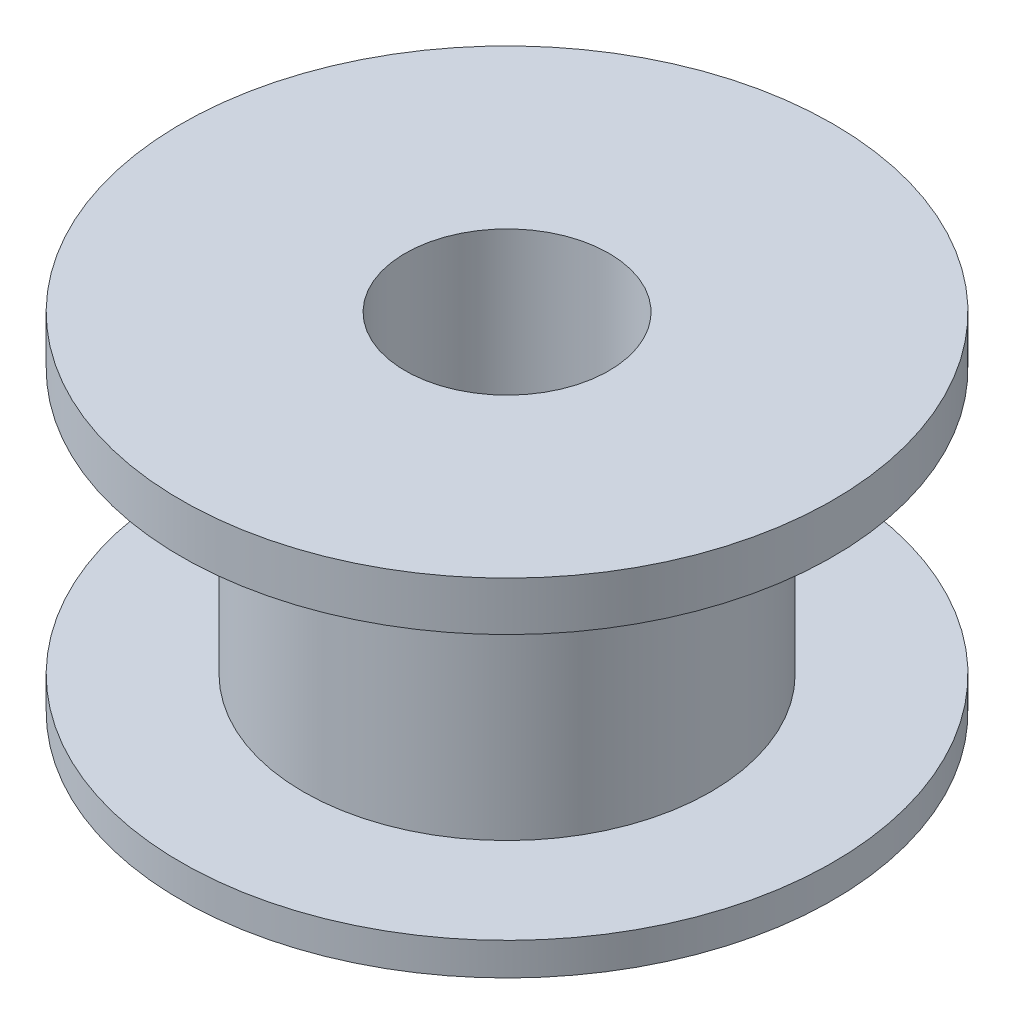
ISO-10303-21;
HEADER;
FILE_DESCRIPTION(('STEP AP214'),'2;1');
FILE_NAME('part.step','',(''),(''),'','','');
FILE_SCHEMA(('AUTOMOTIVE_DESIGN { 1 0 10303 214 1 1 1 1 }'));
ENDSEC;
DATA;
#1=APPLICATION_CONTEXT('core data for automotive mechanical design processes');
#2=APPLICATION_PROTOCOL_DEFINITION('international standard','automotive_design',2000,#1);
#3=PRODUCT_CONTEXT('',#1,'mechanical');
#4=PRODUCT('Part','Part','',(#3));
#5=PRODUCT_RELATED_PRODUCT_CATEGORY('part','',(#4));
#6=PRODUCT_DEFINITION_FORMATION('','',#4);
#7=PRODUCT_DEFINITION_CONTEXT('part definition',#1,'design');
#8=PRODUCT_DEFINITION('design','',#6,#7);
#9=PRODUCT_DEFINITION_SHAPE('','',#8);
#10=(LENGTH_UNIT() NAMED_UNIT(*) SI_UNIT(.MILLI.,.METRE.));
#11=(NAMED_UNIT(*) PLANE_ANGLE_UNIT() SI_UNIT($,.RADIAN.));
#12=(NAMED_UNIT(*) SI_UNIT($,.STERADIAN.) SOLID_ANGLE_UNIT());
#13=UNCERTAINTY_MEASURE_WITH_UNIT(LENGTH_MEASURE(1.E-05),#10,'distance_accuracy_value','');
#14=(GEOMETRIC_REPRESENTATION_CONTEXT(3) GLOBAL_UNCERTAINTY_ASSIGNED_CONTEXT((#13)) GLOBAL_UNIT_ASSIGNED_CONTEXT((#10,
#11,#12)) REPRESENTATION_CONTEXT('',''));
#15=CARTESIAN_POINT('',(0.,0.,0.));
#16=DIRECTION('',(0.,0.,1.));
#17=DIRECTION('',(1.,0.,0.));
#18=AXIS2_PLACEMENT_3D('',#15,#16,#17);
#19=CARTESIAN_POINT('',(8.,-4.25,0.));
#20=DIRECTION('',(0.,-1.,0.));
#21=DIRECTION('',(0.,0.,-1.));
#22=AXIS2_PLACEMENT_3D('',#19,#20,#21);
#23=PLANE('',#22);
#24=CARTESIAN_POINT('',(0.,-4.25,0.));
#25=DIRECTION('',(0.,-1.,0.));
#26=DIRECTION('',(0.,0.,-1.));
#27=AXIS2_PLACEMENT_3D('',#24,#25,#26);
#28=CIRCLE('',#27,8.);
#29=CARTESIAN_POINT('',(0.,-4.25,-8.));
#30=VERTEX_POINT('',#29);
#31=EDGE_CURVE('E59',#30,#30,#28,.T.);
#32=ORIENTED_EDGE('',*,*,#31,.T.);
#33=EDGE_LOOP('',(#32));
#34=FACE_BOUND('',#33,.T.);
#35=CARTESIAN_POINT('',(0.,-4.25,0.));
#36=DIRECTION('',(0.,-1.,0.));
#37=DIRECTION('',(0.,0.,-1.));
#38=AXIS2_PLACEMENT_3D('',#35,#36,#37);
#39=CIRCLE('',#38,2.5);
#40=CARTESIAN_POINT('',(0.,-4.25,-2.5));
#41=VERTEX_POINT('',#40);
#42=EDGE_CURVE('E10',#41,#41,#39,.T.);
#43=ORIENTED_EDGE('',*,*,#42,.F.);
#44=EDGE_LOOP('',(#43));
#45=FACE_BOUND('',#44,.T.);
#46=ADVANCED_FACE('F31',(#34,#45),#23,.T.);
#47=CARTESIAN_POINT('',(0.,-4.88152890571142,0.));
#48=DIRECTION('',(0.,-1.,0.));
#49=DIRECTION('',(0.,0.,-1.));
#50=AXIS2_PLACEMENT_3D('',#47,#48,#49);
#51=CYLINDRICAL_SURFACE('',#50,2.5);
#52=ORIENTED_EDGE('',*,*,#42,.T.);
#53=EDGE_LOOP('',(#52));
#54=FACE_BOUND('',#53,.T.);
#55=CARTESIAN_POINT('',(0.,4.25,0.));
#56=DIRECTION('',(0.,-1.,0.));
#57=DIRECTION('',(0.,0.,-1.));
#58=AXIS2_PLACEMENT_3D('',#55,#56,#57);
#59=CIRCLE('',#58,2.5);
#60=CARTESIAN_POINT('',(0.,4.25,-2.5));
#61=VERTEX_POINT('',#60);
#62=EDGE_CURVE('E37',#61,#61,#59,.T.);
#63=ORIENTED_EDGE('',*,*,#62,.F.);
#64=EDGE_LOOP('',(#63));
#65=FACE_BOUND('',#64,.T.);
#66=ADVANCED_FACE('F77',(#54,#65),#51,.F.);
#67=CARTESIAN_POINT('',(2.5,4.25,0.));
#68=DIRECTION('',(0.,1.,0.));
#69=DIRECTION('',(0.,0.,1.));
#70=AXIS2_PLACEMENT_3D('',#67,#68,#69);
#71=PLANE('',#70);
#72=ORIENTED_EDGE('',*,*,#62,.T.);
#73=EDGE_LOOP('',(#72));
#74=FACE_BOUND('',#73,.T.);
#75=CARTESIAN_POINT('',(0.,4.25,0.));
#76=DIRECTION('',(0.,-1.,0.));
#77=DIRECTION('',(0.,0.,-1.));
#78=AXIS2_PLACEMENT_3D('',#75,#76,#77);
#79=CIRCLE('',#78,8.);
#80=CARTESIAN_POINT('',(0.,4.25,-8.));
#81=VERTEX_POINT('',#80);
#82=EDGE_CURVE('E41',#81,#81,#79,.T.);
#83=ORIENTED_EDGE('',*,*,#82,.F.);
#84=EDGE_LOOP('',(#83));
#85=FACE_BOUND('',#84,.T.);
#86=ADVANCED_FACE('F81',(#74,#85),#71,.T.);
#87=CARTESIAN_POINT('',(0.,-4.88152890571142,0.));
#88=DIRECTION('',(0.,-1.,0.));
#89=DIRECTION('',(0.,0.,-1.));
#90=AXIS2_PLACEMENT_3D('',#87,#88,#89);
#91=CYLINDRICAL_SURFACE('',#90,8.);
#92=ORIENTED_EDGE('',*,*,#82,.T.);
#93=EDGE_LOOP('',(#92));
#94=FACE_BOUND('',#93,.T.);
#95=CARTESIAN_POINT('',(0.,3.05,0.));
#96=DIRECTION('',(0.,-1.,0.));
#97=DIRECTION('',(0.,0.,-1.));
#98=AXIS2_PLACEMENT_3D('',#95,#96,#97);
#99=CIRCLE('',#98,8.);
#100=CARTESIAN_POINT('',(0.,3.05,-8.));
#101=VERTEX_POINT('',#100);
#102=EDGE_CURVE('E45',#101,#101,#99,.T.);
#103=ORIENTED_EDGE('',*,*,#102,.F.);
#104=EDGE_LOOP('',(#103));
#105=FACE_BOUND('',#104,.T.);
#106=ADVANCED_FACE('F85',(#94,#105),#91,.T.);
#107=CARTESIAN_POINT('',(8.,3.05,0.));
#108=DIRECTION('',(0.,-1.,0.));
#109=DIRECTION('',(0.,0.,-1.));
#110=AXIS2_PLACEMENT_3D('',#107,#108,#109);
#111=PLANE('',#110);
#112=ORIENTED_EDGE('',*,*,#102,.T.);
#113=EDGE_LOOP('',(#112));
#114=FACE_BOUND('',#113,.T.);
#115=CARTESIAN_POINT('',(0.,3.05,0.));
#116=DIRECTION('',(0.,-1.,0.));
#117=DIRECTION('',(0.,0.,-1.));
#118=AXIS2_PLACEMENT_3D('',#115,#116,#117);
#119=CIRCLE('',#118,5.);
#120=CARTESIAN_POINT('',(0.,3.05,-5.));
#121=VERTEX_POINT('',#120);
#122=EDGE_CURVE('E50',#121,#121,#119,.T.);
#123=ORIENTED_EDGE('',*,*,#122,.F.);
#124=EDGE_LOOP('',(#123));
#125=FACE_BOUND('',#124,.T.);
#126=ADVANCED_FACE('F91',(#114,#125),#111,.T.);
#127=CARTESIAN_POINT('',(0.,-4.88152890571142,0.));
#128=DIRECTION('',(0.,-1.,0.));
#129=DIRECTION('',(0.,0.,-1.));
#130=AXIS2_PLACEMENT_3D('',#127,#128,#129);
#131=CYLINDRICAL_SURFACE('',#130,5.);
#132=ORIENTED_EDGE('',*,*,#122,.T.);
#133=EDGE_LOOP('',(#132));
#134=FACE_BOUND('',#133,.T.);
#135=CARTESIAN_POINT('',(0.,-3.45,0.));
#136=DIRECTION('',(0.,-1.,0.));
#137=DIRECTION('',(0.,0.,-1.));
#138=AXIS2_PLACEMENT_3D('',#135,#136,#137);
#139=CIRCLE('',#138,5.);
#140=CARTESIAN_POINT('',(0.,-3.45,-5.));
#141=VERTEX_POINT('',#140);
#142=EDGE_CURVE('E53',#141,#141,#139,.T.);
#143=ORIENTED_EDGE('',*,*,#142,.F.);
#144=EDGE_LOOP('',(#143));
#145=FACE_BOUND('',#144,.T.);
#146=ADVANCED_FACE('F73',(#134,#145),#131,.T.);
#147=CARTESIAN_POINT('',(5.,-3.45,0.));
#148=DIRECTION('',(0.,1.,0.));
#149=DIRECTION('',(0.,0.,1.));
#150=AXIS2_PLACEMENT_3D('',#147,#148,#149);
#151=PLANE('',#150);
#152=ORIENTED_EDGE('',*,*,#142,.T.);
#153=EDGE_LOOP('',(#152));
#154=FACE_BOUND('',#153,.T.);
#155=CARTESIAN_POINT('',(0.,-3.45,0.));
#156=DIRECTION('',(0.,-1.,0.));
#157=DIRECTION('',(0.,0.,-1.));
#158=AXIS2_PLACEMENT_3D('',#155,#156,#157);
#159=CIRCLE('',#158,8.);
#160=CARTESIAN_POINT('',(0.,-3.45,-8.));
#161=VERTEX_POINT('',#160);
#162=EDGE_CURVE('E56',#161,#161,#159,.T.);
#163=ORIENTED_EDGE('',*,*,#162,.F.);
#164=EDGE_LOOP('',(#163));
#165=FACE_BOUND('',#164,.T.);
#166=ADVANCED_FACE('F67',(#154,#165),#151,.T.);
#167=CARTESIAN_POINT('',(0.,-4.88152890571142,0.));
#168=DIRECTION('',(0.,-1.,0.));
#169=DIRECTION('',(0.,0.,-1.));
#170=AXIS2_PLACEMENT_3D('',#167,#168,#169);
#171=CYLINDRICAL_SURFACE('',#170,8.);
#172=ORIENTED_EDGE('',*,*,#162,.T.);
#173=EDGE_LOOP('',(#172));
#174=FACE_BOUND('',#173,.T.);
#175=ORIENTED_EDGE('',*,*,#31,.F.);
#176=EDGE_LOOP('',(#175));
#177=FACE_BOUND('',#176,.T.);
#178=ADVANCED_FACE('F65',(#174,#177),#171,.T.);
#179=CLOSED_SHELL('',(#46,#66,#86,#106,#126,#146,#166,#178));
#180=MANIFOLD_SOLID_BREP('B2',#179);
#181=ADVANCED_BREP_SHAPE_REPRESENTATION('',(#18,#180),#14);
#182=SHAPE_DEFINITION_REPRESENTATION(#9,#181);
ENDSEC;
END-ISO-10303-21;
